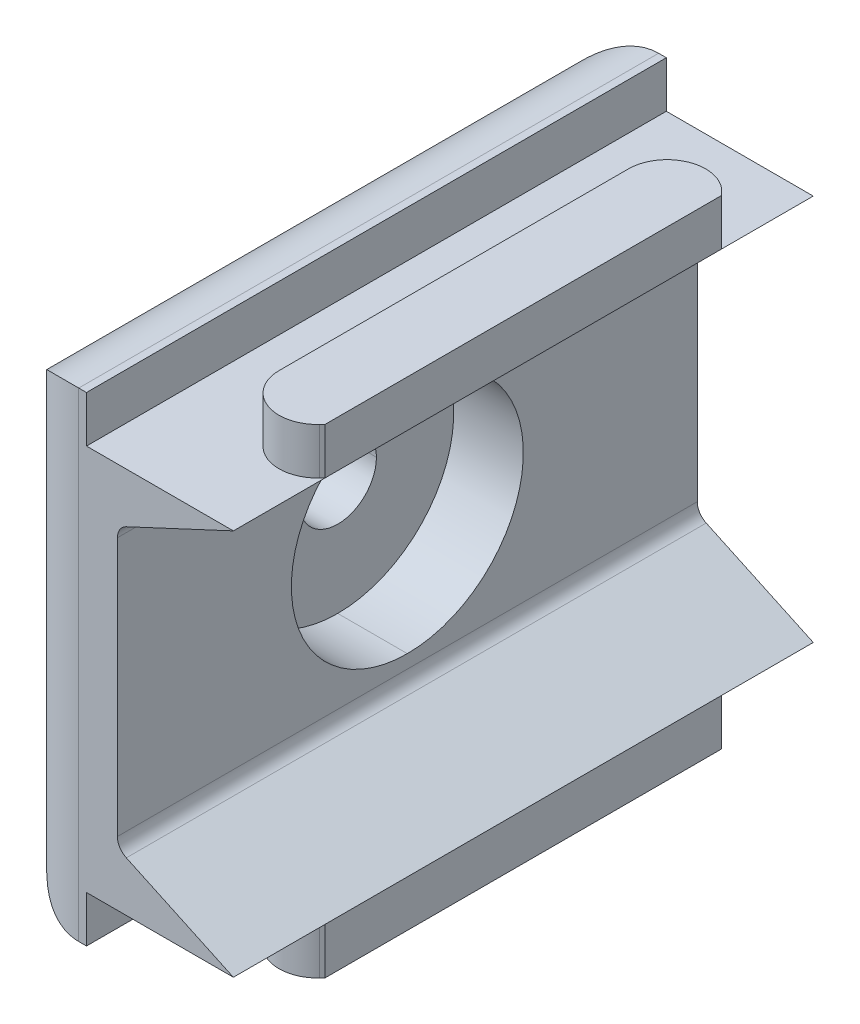
ISO-10303-21;
HEADER;
FILE_DESCRIPTION(('STEP AP214'),'2;1');
FILE_NAME('part.step','',(''),(''),'','','');
FILE_SCHEMA(('AUTOMOTIVE_DESIGN { 1 0 10303 214 1 1 1 1 }'));
ENDSEC;
DATA;
#1=APPLICATION_CONTEXT('core data for automotive mechanical design processes');
#2=APPLICATION_PROTOCOL_DEFINITION('international standard','automotive_design',2000,#1);
#3=PRODUCT_CONTEXT('',#1,'mechanical');
#4=PRODUCT('Part','Part','',(#3));
#5=PRODUCT_RELATED_PRODUCT_CATEGORY('part','',(#4));
#6=PRODUCT_DEFINITION_FORMATION('','',#4);
#7=PRODUCT_DEFINITION_CONTEXT('part definition',#1,'design');
#8=PRODUCT_DEFINITION('design','',#6,#7);
#9=PRODUCT_DEFINITION_SHAPE('','',#8);
#10=(LENGTH_UNIT() NAMED_UNIT(*) SI_UNIT(.MILLI.,.METRE.));
#11=(NAMED_UNIT(*) PLANE_ANGLE_UNIT() SI_UNIT($,.RADIAN.));
#12=(NAMED_UNIT(*) SI_UNIT($,.STERADIAN.) SOLID_ANGLE_UNIT());
#13=UNCERTAINTY_MEASURE_WITH_UNIT(LENGTH_MEASURE(1.E-05),#10,'distance_accuracy_value','');
#14=(GEOMETRIC_REPRESENTATION_CONTEXT(3) GLOBAL_UNCERTAINTY_ASSIGNED_CONTEXT((#13)) GLOBAL_UNIT_ASSIGNED_CONTEXT((#10,
#11,#12)) REPRESENTATION_CONTEXT('',''));
#15=CARTESIAN_POINT('',(0.,0.,0.));
#16=DIRECTION('',(0.,0.,1.));
#17=DIRECTION('',(1.,0.,0.));
#18=AXIS2_PLACEMENT_3D('',#15,#16,#17);
#19=CARTESIAN_POINT('',(17.,41.7312446060602,75.));
#20=DIRECTION('',(0.,0.,1.));
#21=DIRECTION('',(1.,0.,0.));
#22=AXIS2_PLACEMENT_3D('',#19,#20,#21);
#23=CYLINDRICAL_SURFACE('',#22,2.);
#24=CARTESIAN_POINT('',(17.,41.7312446060602,75.));
#25=DIRECTION('',(0.,0.,-1.));
#26=DIRECTION('',(-1.,0.,0.));
#27=AXIS2_PLACEMENT_3D('',#24,#25,#26);
#28=CIRCLE('',#27,2.);
#29=CARTESIAN_POINT('',(15.,41.7312446060602,75.));
#30=VERTEX_POINT('',#29);
#31=CARTESIAN_POINT('',(16.1547634765186,43.5438601801334,75.));
#32=VERTEX_POINT('',#31);
#33=EDGE_CURVE('E304',#30,#32,#28,.T.);
#34=ORIENTED_EDGE('',*,*,#33,.F.);
#35=DIRECTION('',(0.,0.,1.));
#36=VECTOR('',#35,1.);
#37=CARTESIAN_POINT('',(15.,41.7312446060602,75.));
#38=LINE('',#37,#36);
#39=CARTESIAN_POINT('',(15.,41.7312446060602,0.));
#40=VERTEX_POINT('',#39);
#41=EDGE_CURVE('E517',#40,#30,#38,.T.);
#42=ORIENTED_EDGE('',*,*,#41,.F.);
#43=CARTESIAN_POINT('',(17.,41.7312446060602,0.));
#44=DIRECTION('',(0.,0.,1.));
#45=DIRECTION('',(-1.,0.,0.));
#46=AXIS2_PLACEMENT_3D('',#43,#44,#45);
#47=CIRCLE('',#46,2.);
#48=CARTESIAN_POINT('',(16.1547634765186,43.5438601801334,0.));
#49=VERTEX_POINT('',#48);
#50=EDGE_CURVE('E294',#49,#40,#47,.T.);
#51=ORIENTED_EDGE('',*,*,#50,.F.);
#52=DIRECTION('',(0.,0.,-1.));
#53=VECTOR('',#52,1.);
#54=CARTESIAN_POINT('',(16.1547634765186,43.5438601801334,0.));
#55=LINE('',#54,#53);
#56=EDGE_CURVE('E408',#32,#49,#55,.T.);
#57=ORIENTED_EDGE('',*,*,#56,.F.);
#58=EDGE_LOOP('',(#34,#42,#51,#57));
#59=FACE_BOUND('',#58,.T.);
#60=ADVANCED_FACE('F16',(#59),#23,.F.);
#61=CARTESIAN_POINT('',(17.,8.26875539393999,75.));
#62=DIRECTION('',(0.,0.,1.));
#63=DIRECTION('',(1.,0.,0.));
#64=AXIS2_PLACEMENT_3D('',#61,#62,#63);
#65=CYLINDRICAL_SURFACE('',#64,2.);
#66=CARTESIAN_POINT('',(17.,8.26875539393999,75.));
#67=DIRECTION('',(0.,0.,-1.));
#68=DIRECTION('',(-1.,0.,0.));
#69=AXIS2_PLACEMENT_3D('',#66,#67,#68);
#70=CIRCLE('',#69,2.);
#71=CARTESIAN_POINT('',(16.1547634765186,6.45613981986669,75.));
#72=VERTEX_POINT('',#71);
#73=CARTESIAN_POINT('',(15.,8.26875539393999,75.));
#74=VERTEX_POINT('',#73);
#75=EDGE_CURVE('E590',#72,#74,#70,.T.);
#76=ORIENTED_EDGE('',*,*,#75,.F.);
#77=DIRECTION('',(0.,0.,1.));
#78=VECTOR('',#77,1.);
#79=CARTESIAN_POINT('',(16.1547634765186,6.45613981986669,75.));
#80=LINE('',#79,#78);
#81=CARTESIAN_POINT('',(16.1547634765186,6.45613981986669,0.));
#82=VERTEX_POINT('',#81);
#83=EDGE_CURVE('E434',#82,#72,#80,.T.);
#84=ORIENTED_EDGE('',*,*,#83,.F.);
#85=CARTESIAN_POINT('',(17.,8.26875539393999,0.));
#86=DIRECTION('',(0.,0.,1.));
#87=DIRECTION('',(-1.,0.,0.));
#88=AXIS2_PLACEMENT_3D('',#85,#86,#87);
#89=CIRCLE('',#88,2.);
#90=CARTESIAN_POINT('',(15.,8.26875539393999,0.));
#91=VERTEX_POINT('',#90);
#92=EDGE_CURVE('E457',#91,#82,#89,.T.);
#93=ORIENTED_EDGE('',*,*,#92,.F.);
#94=DIRECTION('',(0.,0.,-1.));
#95=VECTOR('',#94,1.);
#96=CARTESIAN_POINT('',(15.,8.26875539393999,0.));
#97=LINE('',#96,#95);
#98=EDGE_CURVE('E449',#74,#91,#97,.T.);
#99=ORIENTED_EDGE('',*,*,#98,.F.);
#100=EDGE_LOOP('',(#76,#84,#93,#99));
#101=FACE_BOUND('',#100,.T.);
#102=ADVANCED_FACE('F648',(#101),#65,.F.);
#103=CARTESIAN_POINT('',(10.,46.,0.));
#104=DIRECTION('',(0.,0.,1.));
#105=DIRECTION('',(1.,0.,0.));
#106=AXIS2_PLACEMENT_3D('',#103,#104,#105);
#107=CYLINDRICAL_SURFACE('',#106,10.);
#108=CARTESIAN_POINT('',(10.,56.,0.));
#109=CARTESIAN_POINT('',(4.14213562373095,56.,0.));
#110=CARTESIAN_POINT('',(0.,51.857864376269,4.14213562373095));
#111=CARTESIAN_POINT('',(0.,46.,10.));
#112=(BOUNDED_CURVE() B_SPLINE_CURVE(3,(#108,#109,#110,#111),.UNSPECIFIED.,.F.,
.F.) B_SPLINE_CURVE_WITH_KNOTS((4,4),(0.,1.5707963267949),
.UNSPECIFIED.) CURVE() GEOMETRIC_REPRESENTATION_ITEM() RATIONAL_B_SPLINE_CURVE((1.,
0.804737854124365,0.804737854124365,1.)) REPRESENTATION_ITEM(''));
#113=CARTESIAN_POINT('',(10.,56.,0.));
#114=VERTEX_POINT('',#113);
#115=CARTESIAN_POINT('',(0.,46.,10.));
#116=VERTEX_POINT('',#115);
#117=EDGE_CURVE('E26',#114,#116,#112,.T.);
#118=ORIENTED_EDGE('',*,*,#117,.T.);
#119=DIRECTION('',(0.,0.,-1.));
#120=VECTOR('',#119,1.);
#121=CARTESIAN_POINT('',(0.,46.,75.));
#122=LINE('',#121,#120);
#123=CARTESIAN_POINT('',(0.,46.,65.));
#124=VERTEX_POINT('',#123);
#125=EDGE_CURVE('E398',#124,#116,#122,.T.);
#126=ORIENTED_EDGE('',*,*,#125,.F.);
#127=CARTESIAN_POINT('',(0.,46.,65.));
#128=CARTESIAN_POINT('',(0.,51.857864376269,70.857864376269));
#129=CARTESIAN_POINT('',(4.14213562373095,56.,75.));
#130=CARTESIAN_POINT('',(10.,56.,75.));
#131=(BOUNDED_CURVE() B_SPLINE_CURVE(3,(#127,#128,#129,#130),.UNSPECIFIED.,.F.,
.F.) B_SPLINE_CURVE_WITH_KNOTS((4,4),(1.5707963267949,3.1415926535898),
.UNSPECIFIED.) CURVE() GEOMETRIC_REPRESENTATION_ITEM() RATIONAL_B_SPLINE_CURVE((1.,
0.804737854124365,0.804737854124365,1.)) REPRESENTATION_ITEM(''));
#132=CARTESIAN_POINT('',(10.,56.,75.));
#133=VERTEX_POINT('',#132);
#134=EDGE_CURVE('E10',#124,#133,#131,.T.);
#135=ORIENTED_EDGE('',*,*,#134,.T.);
#136=DIRECTION('',(0.,0.,1.));
#137=VECTOR('',#136,1.);
#138=CARTESIAN_POINT('',(10.,56.,0.));
#139=LINE('',#138,#137);
#140=EDGE_CURVE('E540',#114,#133,#139,.T.);
#141=ORIENTED_EDGE('',*,*,#140,.F.);
#142=EDGE_LOOP('',(#118,#126,#135,#141));
#143=FACE_BOUND('',#142,.T.);
#144=ADVANCED_FACE('F1134',(#143),#107,.T.);
#145=CARTESIAN_POINT('',(10.,0.,65.));
#146=DIRECTION('',(0.,-1.,0.));
#147=DIRECTION('',(0.,0.,-1.));
#148=AXIS2_PLACEMENT_3D('',#145,#146,#147);
#149=CYLINDRICAL_SURFACE('',#148,10.);
#150=CARTESIAN_POINT('',(0.,4.,65.));
#151=CARTESIAN_POINT('',(0.,-1.85786437626905,70.857864376269));
#152=CARTESIAN_POINT('',(4.14213562373095,-6.,75.));
#153=CARTESIAN_POINT('',(10.,-6.,75.));
#154=(BOUNDED_CURVE() B_SPLINE_CURVE(3,(#150,#151,#152,#153),.UNSPECIFIED.,.F.,
.F.) B_SPLINE_CURVE_WITH_KNOTS((4,4),(1.5707963267949,3.1415926535898),
.UNSPECIFIED.) CURVE() GEOMETRIC_REPRESENTATION_ITEM() RATIONAL_B_SPLINE_CURVE((1.,
0.804737854124365,0.804737854124365,1.)) REPRESENTATION_ITEM(''));
#155=CARTESIAN_POINT('',(0.,4.,65.));
#156=VERTEX_POINT('',#155);
#157=CARTESIAN_POINT('',(10.,-6.,75.));
#158=VERTEX_POINT('',#157);
#159=EDGE_CURVE('E440',#156,#158,#154,.T.);
#160=ORIENTED_EDGE('',*,*,#159,.T.);
#161=DIRECTION('',(0.,-1.,0.));
#162=VECTOR('',#161,1.);
#163=CARTESIAN_POINT('',(10.,0.,75.));
#164=LINE('',#163,#162);
#165=EDGE_CURVE('E424',#133,#158,#164,.T.);
#166=ORIENTED_EDGE('',*,*,#165,.F.);
#167=ORIENTED_EDGE('',*,*,#134,.F.);
#168=DIRECTION('',(0.,1.,0.));
#169=VECTOR('',#168,1.);
#170=CARTESIAN_POINT('',(0.,0.,65.));
#171=LINE('',#170,#169);
#172=EDGE_CURVE('E394',#156,#124,#171,.T.);
#173=ORIENTED_EDGE('',*,*,#172,.F.);
#174=EDGE_LOOP('',(#160,#166,#167,#173));
#175=FACE_BOUND('',#174,.T.);
#176=ADVANCED_FACE('F1158',(#175),#149,.T.);
#177=CARTESIAN_POINT('',(10.,0.,10.));
#178=DIRECTION('',(0.,1.,0.));
#179=DIRECTION('',(0.,0.,1.));
#180=AXIS2_PLACEMENT_3D('',#177,#178,#179);
#181=CYLINDRICAL_SURFACE('',#180,10.);
#182=CARTESIAN_POINT('',(10.,-6.,0.));
#183=CARTESIAN_POINT('',(4.14213562373095,-6.,0.));
#184=CARTESIAN_POINT('',(0.,-1.85786437626905,4.14213562373095));
#185=CARTESIAN_POINT('',(0.,4.,10.));
#186=(BOUNDED_CURVE() B_SPLINE_CURVE(3,(#182,#183,#184,#185),.UNSPECIFIED.,.F.,
.F.) B_SPLINE_CURVE_WITH_KNOTS((4,4),(0.,1.5707963267949),
.UNSPECIFIED.) CURVE() GEOMETRIC_REPRESENTATION_ITEM() RATIONAL_B_SPLINE_CURVE((1.,
0.804737854124365,0.804737854124365,1.)) REPRESENTATION_ITEM(''));
#187=CARTESIAN_POINT('',(10.,-6.,0.));
#188=VERTEX_POINT('',#187);
#189=CARTESIAN_POINT('',(0.,4.,10.));
#190=VERTEX_POINT('',#189);
#191=EDGE_CURVE('E472',#188,#190,#186,.T.);
#192=ORIENTED_EDGE('',*,*,#191,.T.);
#193=DIRECTION('',(0.,-1.,0.));
#194=VECTOR('',#193,1.);
#195=CARTESIAN_POINT('',(0.,-6.,10.));
#196=LINE('',#195,#194);
#197=EDGE_CURVE('E376',#116,#190,#196,.T.);
#198=ORIENTED_EDGE('',*,*,#197,.F.);
#199=ORIENTED_EDGE('',*,*,#117,.F.);
#200=DIRECTION('',(0.,1.,0.));
#201=VECTOR('',#200,1.);
#202=CARTESIAN_POINT('',(10.,56.,0.));
#203=LINE('',#202,#201);
#204=EDGE_CURVE('E494',#188,#114,#203,.T.);
#205=ORIENTED_EDGE('',*,*,#204,.F.);
#206=EDGE_LOOP('',(#192,#198,#199,#205));
#207=FACE_BOUND('',#206,.T.);
#208=ADVANCED_FACE('F1150',(#207),#181,.T.);
#209=CARTESIAN_POINT('',(10.,4.,0.));
#210=DIRECTION('',(0.,0.,-1.));
#211=DIRECTION('',(-1.,0.,0.));
#212=AXIS2_PLACEMENT_3D('',#209,#210,#211);
#213=CYLINDRICAL_SURFACE('',#212,10.);
#214=ORIENTED_EDGE('',*,*,#159,.F.);
#215=DIRECTION('',(0.,0.,1.));
#216=VECTOR('',#215,1.);
#217=CARTESIAN_POINT('',(0.,4.,75.));
#218=LINE('',#217,#216);
#219=EDGE_CURVE('E526',#190,#156,#218,.T.);
#220=ORIENTED_EDGE('',*,*,#219,.F.);
#221=ORIENTED_EDGE('',*,*,#191,.F.);
#222=DIRECTION('',(0.,0.,-1.));
#223=VECTOR('',#222,1.);
#224=CARTESIAN_POINT('',(10.,-6.,0.));
#225=LINE('',#224,#223);
#226=EDGE_CURVE('E436',#158,#188,#225,.T.);
#227=ORIENTED_EDGE('',*,*,#226,.F.);
#228=EDGE_LOOP('',(#214,#220,#221,#227));
#229=FACE_BOUND('',#228,.T.);
#230=ADVANCED_FACE('F1546',(#229),#213,.T.);
#231=CARTESIAN_POINT('',(0.,-6.,0.));
#232=DIRECTION('',(0.,1.,0.));
#233=DIRECTION('',(1.,0.,0.));
#234=AXIS2_PLACEMENT_3D('',#231,#232,#233);
#235=PLANE('',#234);
#236=DIRECTION('',(-1.,0.,0.));
#237=VECTOR('',#236,1.);
#238=CARTESIAN_POINT('',(0.,-6.,75.));
#239=LINE('',#238,#237);
#240=CARTESIAN_POINT('',(11.,-6.,75.));
#241=VERTEX_POINT('',#240);
#242=EDGE_CURVE('E419',#241,#158,#239,.T.);
#243=ORIENTED_EDGE('',*,*,#242,.T.);
#244=ORIENTED_EDGE('',*,*,#226,.T.);
#245=DIRECTION('',(1.,0.,0.));
#246=VECTOR('',#245,1.);
#247=CARTESIAN_POINT('',(0.,-6.,0.));
#248=LINE('',#247,#246);
#249=CARTESIAN_POINT('',(11.,-6.,0.));
#250=VERTEX_POINT('',#249);
#251=EDGE_CURVE('E485',#188,#250,#248,.T.);
#252=ORIENTED_EDGE('',*,*,#251,.T.);
#253=DIRECTION('',(0.,0.,1.));
#254=VECTOR('',#253,1.);
#255=CARTESIAN_POINT('',(11.,-6.,0.));
#256=LINE('',#255,#254);
#257=EDGE_CURVE('E441',#250,#241,#256,.T.);
#258=ORIENTED_EDGE('',*,*,#257,.T.);
#259=EDGE_LOOP('',(#243,#244,#252,#258));
#260=FACE_BOUND('',#259,.T.);
#261=ADVANCED_FACE('F1147',(#260),#235,.F.);
#262=CARTESIAN_POINT('',(11.,-6.,0.));
#263=DIRECTION('',(-1.,0.,0.));
#264=DIRECTION('',(0.,1.,0.));
#265=AXIS2_PLACEMENT_3D('',#262,#263,#264);
#266=PLANE('',#265);
#267=DIRECTION('',(0.,0.,1.));
#268=VECTOR('',#267,1.);
#269=CARTESIAN_POINT('',(11.,0.,0.));
#270=LINE('',#269,#268);
#271=CARTESIAN_POINT('',(11.,0.,0.));
#272=VERTEX_POINT('',#271);
#273=CARTESIAN_POINT('',(11.,0.,75.));
#274=VERTEX_POINT('',#273);
#275=EDGE_CURVE('E538',#272,#274,#270,.T.);
#276=ORIENTED_EDGE('',*,*,#275,.T.);
#277=DIRECTION('',(0.,1.,0.));
#278=VECTOR('',#277,1.);
#279=CARTESIAN_POINT('',(11.,-6.,75.));
#280=LINE('',#279,#278);
#281=EDGE_CURVE('E423',#241,#274,#280,.T.);
#282=ORIENTED_EDGE('',*,*,#281,.F.);
#283=ORIENTED_EDGE('',*,*,#257,.F.);
#284=DIRECTION('',(0.,1.,0.));
#285=VECTOR('',#284,1.);
#286=CARTESIAN_POINT('',(11.,-6.,0.));
#287=LINE('',#286,#285);
#288=EDGE_CURVE('E507',#250,#272,#287,.T.);
#289=ORIENTED_EDGE('',*,*,#288,.T.);
#290=EDGE_LOOP('',(#276,#282,#283,#289));
#291=FACE_BOUND('',#290,.T.);
#292=ADVANCED_FACE('F1144',(#291),#266,.F.);
#293=CARTESIAN_POINT('',(0.,56.,0.));
#294=DIRECTION('',(0.,-1.,0.));
#295=DIRECTION('',(0.,0.,-1.));
#296=AXIS2_PLACEMENT_3D('',#293,#294,#295);
#297=PLANE('',#296);
#298=DIRECTION('',(-1.,0.,0.));
#299=VECTOR('',#298,1.);
#300=CARTESIAN_POINT('',(0.,56.,0.));
#301=LINE('',#300,#299);
#302=CARTESIAN_POINT('',(11.,56.,0.));
#303=VERTEX_POINT('',#302);
#304=EDGE_CURVE('E576',#303,#114,#301,.T.);
#305=ORIENTED_EDGE('',*,*,#304,.T.);
#306=ORIENTED_EDGE('',*,*,#140,.T.);
#307=DIRECTION('',(1.,0.,0.));
#308=VECTOR('',#307,1.);
#309=CARTESIAN_POINT('',(0.,56.,75.));
#310=LINE('',#309,#308);
#311=CARTESIAN_POINT('',(11.,56.,75.));
#312=VERTEX_POINT('',#311);
#313=EDGE_CURVE('E530',#133,#312,#310,.T.);
#314=ORIENTED_EDGE('',*,*,#313,.T.);
#315=DIRECTION('',(0.,0.,-1.));
#316=VECTOR('',#315,1.);
#317=CARTESIAN_POINT('',(11.,56.,75.));
#318=LINE('',#317,#316);
#319=EDGE_CURVE('E195',#312,#303,#318,.T.);
#320=ORIENTED_EDGE('',*,*,#319,.T.);
#321=EDGE_LOOP('',(#305,#306,#314,#320));
#322=FACE_BOUND('',#321,.T.);
#323=ADVANCED_FACE('F1154',(#322),#297,.F.);
#324=CARTESIAN_POINT('',(11.,56.,75.));
#325=DIRECTION('',(-1.,0.,0.));
#326=DIRECTION('',(0.,0.,1.));
#327=AXIS2_PLACEMENT_3D('',#324,#325,#326);
#328=PLANE('',#327);
#329=DIRECTION('',(0.,0.,-1.));
#330=VECTOR('',#329,1.);
#331=CARTESIAN_POINT('',(11.,50.,75.));
#332=LINE('',#331,#330);
#333=CARTESIAN_POINT('',(11.,50.,75.));
#334=VERTEX_POINT('',#333);
#335=CARTESIAN_POINT('',(11.,50.,0.));
#336=VERTEX_POINT('',#335);
#337=EDGE_CURVE('E480',#334,#336,#332,.T.);
#338=ORIENTED_EDGE('',*,*,#337,.T.);
#339=DIRECTION('',(0.,-1.,0.));
#340=VECTOR('',#339,1.);
#341=CARTESIAN_POINT('',(11.,56.,0.));
#342=LINE('',#341,#340);
#343=EDGE_CURVE('E458',#303,#336,#342,.T.);
#344=ORIENTED_EDGE('',*,*,#343,.F.);
#345=ORIENTED_EDGE('',*,*,#319,.F.);
#346=DIRECTION('',(0.,-1.,0.));
#347=VECTOR('',#346,1.);
#348=CARTESIAN_POINT('',(11.,56.,75.));
#349=LINE('',#348,#347);
#350=EDGE_CURVE('E482',#312,#334,#349,.T.);
#351=ORIENTED_EDGE('',*,*,#350,.T.);
#352=EDGE_LOOP('',(#338,#344,#345,#351));
#353=FACE_BOUND('',#352,.T.);
#354=ADVANCED_FACE('F1165',(#353),#328,.F.);
#355=CARTESIAN_POINT('',(0.,-6.,0.));
#356=DIRECTION('',(0.,-1.,0.));
#357=DIRECTION('',(0.,0.,-1.));
#358=AXIS2_PLACEMENT_3D('',#355,#356,#357);
#359=PLANE('',#358);
#360=DIRECTION('',(0.,0.,1.));
#361=VECTOR('',#360,1.);
#362=CARTESIAN_POINT('',(21.,-6.,0.));
#363=LINE('',#362,#361);
#364=CARTESIAN_POINT('',(21.,-6.,14.904265208426));
#365=VERTEX_POINT('',#364);
#366=CARTESIAN_POINT('',(21.,-6.,60.0957347915741));
#367=VERTEX_POINT('',#366);
#368=EDGE_CURVE('E561',#365,#367,#363,.T.);
#369=ORIENTED_EDGE('',*,*,#368,.F.);
#370=CARTESIAN_POINT('',(26.,-6.,14.904265208426));
#371=DIRECTION('',(0.,-1.,0.));
#372=DIRECTION('',(1.,0.,0.));
#373=AXIS2_PLACEMENT_3D('',#370,#371,#372);
#374=CIRCLE('',#373,5.);
#375=CARTESIAN_POINT('',(29.6412568589885,-6.,11.4777146853971));
#376=VERTEX_POINT('',#375);
#377=EDGE_CURVE('E350',#365,#376,#374,.T.);
#378=ORIENTED_EDGE('',*,*,#377,.T.);
#379=DIRECTION('',(-0.68531010460578,0.,-0.728251371797689));
#380=VECTOR('',#379,1.);
#381=CARTESIAN_POINT('',(9.9919672064407,-6.,-9.40279188841087));
#382=LINE('',#381,#380);
#383=CARTESIAN_POINT('',(30.,-6.,11.8589365334464));
#384=VERTEX_POINT('',#383);
#385=EDGE_CURVE('E346',#384,#376,#382,.T.);
#386=ORIENTED_EDGE('',*,*,#385,.F.);
#387=DIRECTION('',(0.,0.,1.));
#388=VECTOR('',#387,1.);
#389=CARTESIAN_POINT('',(30.,-6.,0.));
#390=LINE('',#389,#388);
#391=CARTESIAN_POINT('',(30.,-6.,63.1410634665537));
#392=VERTEX_POINT('',#391);
#393=EDGE_CURVE('E454',#384,#392,#390,.T.);
#394=ORIENTED_EDGE('',*,*,#393,.T.);
#395=DIRECTION('',(0.685310104605782,0.,-0.728251371797687));
#396=VECTOR('',#395,1.);
#397=CARTESIAN_POINT('',(47.4228189903889,-6.,44.62653734902));
#398=LINE('',#397,#396);
#399=CARTESIAN_POINT('',(29.6412568589885,-6.,63.522285314603));
#400=VERTEX_POINT('',#399);
#401=EDGE_CURVE('E453',#400,#392,#398,.T.);
#402=ORIENTED_EDGE('',*,*,#401,.F.);
#403=CARTESIAN_POINT('',(26.,-6.,60.0957347915741));
#404=DIRECTION('',(0.,-1.,0.));
#405=DIRECTION('',(1.,0.,0.));
#406=AXIS2_PLACEMENT_3D('',#403,#404,#405);
#407=CIRCLE('',#406,5.);
#408=EDGE_CURVE('E41',#400,#367,#407,.T.);
#409=ORIENTED_EDGE('',*,*,#408,.T.);
#410=EDGE_LOOP('',(#369,#378,#386,#394,#402,#409));
#411=FACE_BOUND('',#410,.T.);
#412=ADVANCED_FACE('F709',(#411),#359,.T.);
#413=CARTESIAN_POINT('',(26.,-6.,60.0957347915741));
#414=DIRECTION('',(0.,1.,0.));
#415=DIRECTION('',(-1.,0.,0.));
#416=AXIS2_PLACEMENT_3D('',#413,#414,#415);
#417=CYLINDRICAL_SURFACE('',#416,5.);
#418=CARTESIAN_POINT('',(26.,0.,60.0957347915741));
#419=DIRECTION('',(0.,-1.,0.));
#420=DIRECTION('',(1.,0.,0.));
#421=AXIS2_PLACEMENT_3D('',#418,#419,#420);
#422=CIRCLE('',#421,5.);
#423=CARTESIAN_POINT('',(29.6412568589885,0.,63.522285314603));
#424=VERTEX_POINT('',#423);
#425=CARTESIAN_POINT('',(21.,0.,60.0957347915741));
#426=VERTEX_POINT('',#425);
#427=EDGE_CURVE('E490',#424,#426,#422,.T.);
#428=ORIENTED_EDGE('',*,*,#427,.T.);
#429=DIRECTION('',(0.,1.,0.));
#430=VECTOR('',#429,1.);
#431=CARTESIAN_POINT('',(21.,-6.,60.0957347915741));
#432=LINE('',#431,#430);
#433=EDGE_CURVE('E93',#367,#426,#432,.T.);
#434=ORIENTED_EDGE('',*,*,#433,.F.);
#435=ORIENTED_EDGE('',*,*,#408,.F.);
#436=DIRECTION('',(0.,1.,0.));
#437=VECTOR('',#436,1.);
#438=CARTESIAN_POINT('',(29.6412568589885,-6.,63.522285314603));
#439=LINE('',#438,#437);
#440=EDGE_CURVE('E80',#400,#424,#439,.T.);
#441=ORIENTED_EDGE('',*,*,#440,.T.);
#442=EDGE_LOOP('',(#428,#434,#435,#441));
#443=FACE_BOUND('',#442,.T.);
#444=ADVANCED_FACE('F1114',(#443),#417,.T.);
#445=CARTESIAN_POINT('',(47.4228189903889,-6.,44.62653734902));
#446=DIRECTION('',(0.728251371797686,0.,0.685310104605782));
#447=DIRECTION('',(0.,-1.,0.));
#448=AXIS2_PLACEMENT_3D('',#445,#446,#447);
#449=PLANE('',#448);
#450=DIRECTION('',(0.685310104605782,0.,-0.728251371797687));
#451=VECTOR('',#450,1.);
#452=CARTESIAN_POINT('',(47.4228189903889,0.,44.62653734902));
#453=LINE('',#452,#451);
#454=CARTESIAN_POINT('',(30.,0.,63.1410634665537));
#455=VERTEX_POINT('',#454);
#456=EDGE_CURVE('E486',#424,#455,#453,.T.);
#457=ORIENTED_EDGE('',*,*,#456,.F.);
#458=ORIENTED_EDGE('',*,*,#440,.F.);
#459=ORIENTED_EDGE('',*,*,#401,.T.);
#460=DIRECTION('',(0.,1.,0.));
#461=VECTOR('',#460,1.);
#462=CARTESIAN_POINT('',(30.,-6.,63.1410634665537));
#463=LINE('',#462,#461);
#464=EDGE_CURVE('E411',#392,#455,#463,.T.);
#465=ORIENTED_EDGE('',*,*,#464,.T.);
#466=EDGE_LOOP('',(#457,#458,#459,#465));
#467=FACE_BOUND('',#466,.T.);
#468=ADVANCED_FACE('F700',(#467),#449,.T.);
#469=CARTESIAN_POINT('',(30.,-6.,0.));
#470=DIRECTION('',(-1.,0.,0.));
#471=DIRECTION('',(0.,1.,0.));
#472=AXIS2_PLACEMENT_3D('',#469,#470,#471);
#473=PLANE('',#472);
#474=DIRECTION('',(0.,0.,1.));
#475=VECTOR('',#474,1.);
#476=CARTESIAN_POINT('',(30.,0.,0.));
#477=LINE('',#476,#475);
#478=CARTESIAN_POINT('',(30.,0.,11.8589365334464));
#479=VERTEX_POINT('',#478);
#480=EDGE_CURVE('E450',#479,#455,#477,.T.);
#481=ORIENTED_EDGE('',*,*,#480,.T.);
#482=ORIENTED_EDGE('',*,*,#464,.F.);
#483=ORIENTED_EDGE('',*,*,#393,.F.);
#484=DIRECTION('',(0.,1.,0.));
#485=VECTOR('',#484,1.);
#486=CARTESIAN_POINT('',(30.,-6.,11.8589365334464));
#487=LINE('',#486,#485);
#488=EDGE_CURVE('E412',#384,#479,#487,.T.);
#489=ORIENTED_EDGE('',*,*,#488,.T.);
#490=EDGE_LOOP('',(#481,#482,#483,#489));
#491=FACE_BOUND('',#490,.T.);
#492=ADVANCED_FACE('F704',(#491),#473,.F.);
#493=CARTESIAN_POINT('',(9.9919672064407,-6.,-9.40279188841087));
#494=DIRECTION('',(0.728251371797689,0.,-0.68531010460578));
#495=DIRECTION('',(0.,-1.,0.));
#496=AXIS2_PLACEMENT_3D('',#493,#494,#495);
#497=PLANE('',#496);
#498=DIRECTION('',(-0.68531010460578,0.,-0.728251371797689));
#499=VECTOR('',#498,1.);
#500=CARTESIAN_POINT('',(9.9919672064407,0.,-9.40279188841087));
#501=LINE('',#500,#499);
#502=CARTESIAN_POINT('',(29.6412568589885,0.,11.4777146853971));
#503=VERTEX_POINT('',#502);
#504=EDGE_CURVE('E343',#479,#503,#501,.T.);
#505=ORIENTED_EDGE('',*,*,#504,.F.);
#506=ORIENTED_EDGE('',*,*,#488,.F.);
#507=ORIENTED_EDGE('',*,*,#385,.T.);
#508=DIRECTION('',(0.,1.,0.));
#509=VECTOR('',#508,1.);
#510=CARTESIAN_POINT('',(29.6412568589885,-6.,11.4777146853971));
#511=LINE('',#510,#509);
#512=EDGE_CURVE('E338',#376,#503,#511,.T.);
#513=ORIENTED_EDGE('',*,*,#512,.T.);
#514=EDGE_LOOP('',(#505,#506,#507,#513));
#515=FACE_BOUND('',#514,.T.);
#516=ADVANCED_FACE('F340',(#515),#497,.T.);
#517=CARTESIAN_POINT('',(26.,-6.,14.904265208426));
#518=DIRECTION('',(0.,1.,0.));
#519=DIRECTION('',(-1.,0.,0.));
#520=AXIS2_PLACEMENT_3D('',#517,#518,#519);
#521=CYLINDRICAL_SURFACE('',#520,5.);
#522=CARTESIAN_POINT('',(26.,0.,14.904265208426));
#523=DIRECTION('',(0.,-1.,0.));
#524=DIRECTION('',(1.,0.,0.));
#525=AXIS2_PLACEMENT_3D('',#522,#523,#524);
#526=CIRCLE('',#525,5.);
#527=CARTESIAN_POINT('',(21.,0.,14.904265208426));
#528=VERTEX_POINT('',#527);
#529=EDGE_CURVE('E353',#528,#503,#526,.T.);
#530=ORIENTED_EDGE('',*,*,#529,.T.);
#531=ORIENTED_EDGE('',*,*,#512,.F.);
#532=ORIENTED_EDGE('',*,*,#377,.F.);
#533=DIRECTION('',(0.,1.,0.));
#534=VECTOR('',#533,1.);
#535=CARTESIAN_POINT('',(21.,-6.,14.904265208426));
#536=LINE('',#535,#534);
#537=EDGE_CURVE('E356',#365,#528,#536,.T.);
#538=ORIENTED_EDGE('',*,*,#537,.T.);
#539=EDGE_LOOP('',(#530,#531,#532,#538));
#540=FACE_BOUND('',#539,.T.);
#541=ADVANCED_FACE('F354',(#540),#521,.T.);
#542=CARTESIAN_POINT('',(21.,-6.,0.));
#543=DIRECTION('',(-1.,0.,0.));
#544=DIRECTION('',(0.,1.,0.));
#545=AXIS2_PLACEMENT_3D('',#542,#543,#544);
#546=PLANE('',#545);
#547=DIRECTION('',(0.,0.,1.));
#548=VECTOR('',#547,1.);
#549=CARTESIAN_POINT('',(21.,0.,0.));
#550=LINE('',#549,#548);
#551=EDGE_CURVE('E360',#528,#426,#550,.T.);
#552=ORIENTED_EDGE('',*,*,#551,.F.);
#553=ORIENTED_EDGE('',*,*,#537,.F.);
#554=ORIENTED_EDGE('',*,*,#368,.T.);
#555=ORIENTED_EDGE('',*,*,#433,.T.);
#556=EDGE_LOOP('',(#552,#553,#554,#555));
#557=FACE_BOUND('',#556,.T.);
#558=ADVANCED_FACE('F1115',(#557),#546,.T.);
#559=CARTESIAN_POINT('',(26.,56.,60.0957347915741));
#560=DIRECTION('',(0.,-1.,0.));
#561=DIRECTION('',(0.,0.,-1.));
#562=AXIS2_PLACEMENT_3D('',#559,#560,#561);
#563=CYLINDRICAL_SURFACE('',#562,5.);
#564=CARTESIAN_POINT('',(26.,56.,60.0957347915741));
#565=DIRECTION('',(0.,1.,0.));
#566=DIRECTION('',(0.,0.,-1.));
#567=AXIS2_PLACEMENT_3D('',#564,#565,#566);
#568=CIRCLE('',#567,5.);
#569=CARTESIAN_POINT('',(21.,56.,60.0957347915741));
#570=VERTEX_POINT('',#569);
#571=CARTESIAN_POINT('',(29.6412568589885,56.,63.522285314603));
#572=VERTEX_POINT('',#571);
#573=EDGE_CURVE('E384',#570,#572,#568,.T.);
#574=ORIENTED_EDGE('',*,*,#573,.F.);
#575=DIRECTION('',(0.,1.,0.));
#576=VECTOR('',#575,1.);
#577=CARTESIAN_POINT('',(21.,56.,60.0957347915741));
#578=LINE('',#577,#576);
#579=CARTESIAN_POINT('',(21.,50.,60.0957347915741));
#580=VERTEX_POINT('',#579);
#581=EDGE_CURVE('E591',#580,#570,#578,.T.);
#582=ORIENTED_EDGE('',*,*,#581,.F.);
#583=CARTESIAN_POINT('',(26.,50.,60.0957347915741));
#584=DIRECTION('',(0.,-1.,0.));
#585=DIRECTION('',(0.,0.,-1.));
#586=AXIS2_PLACEMENT_3D('',#583,#584,#585);
#587=CIRCLE('',#586,5.);
#588=CARTESIAN_POINT('',(29.6412568589885,50.,63.522285314603));
#589=VERTEX_POINT('',#588);
#590=EDGE_CURVE('E393',#589,#580,#587,.T.);
#591=ORIENTED_EDGE('',*,*,#590,.F.);
#592=DIRECTION('',(0.,-1.,0.));
#593=VECTOR('',#592,1.);
#594=CARTESIAN_POINT('',(29.6412568589885,56.,63.522285314603));
#595=LINE('',#594,#593);
#596=EDGE_CURVE('E534',#572,#589,#595,.T.);
#597=ORIENTED_EDGE('',*,*,#596,.F.);
#598=EDGE_LOOP('',(#574,#582,#591,#597));
#599=FACE_BOUND('',#598,.T.);
#600=ADVANCED_FACE('F1117',(#599),#563,.T.);
#601=CARTESIAN_POINT('',(26.,56.,14.904265208426));
#602=DIRECTION('',(0.,-1.,0.));
#603=DIRECTION('',(0.,0.,-1.));
#604=AXIS2_PLACEMENT_3D('',#601,#602,#603);
#605=CYLINDRICAL_SURFACE('',#604,5.);
#606=DIRECTION('',(0.,-1.,0.));
#607=VECTOR('',#606,1.);
#608=CARTESIAN_POINT('',(26.,56.,9.90426520842599));
#609=LINE('',#608,#607);
#610=CARTESIAN_POINT('',(26.,56.,9.90426520842599));
#611=VERTEX_POINT('',#610);
#612=CARTESIAN_POINT('',(26.,50.,9.90426520842599));
#613=VERTEX_POINT('',#612);
#614=EDGE_CURVE('E383',#611,#613,#609,.T.);
#615=ORIENTED_EDGE('',*,*,#614,.F.);
#616=CARTESIAN_POINT('',(26.,56.,14.904265208426));
#617=DIRECTION('',(0.,1.,0.));
#618=DIRECTION('',(0.,0.,-1.));
#619=AXIS2_PLACEMENT_3D('',#616,#617,#618);
#620=CIRCLE('',#619,5.);
#621=CARTESIAN_POINT('',(29.6412568589885,56.,11.4777146853971));
#622=VERTEX_POINT('',#621);
#623=EDGE_CURVE('E387',#622,#611,#620,.T.);
#624=ORIENTED_EDGE('',*,*,#623,.F.);
#625=DIRECTION('',(0.,1.,0.));
#626=VECTOR('',#625,1.);
#627=CARTESIAN_POINT('',(29.6412568589885,56.,11.4777146853971));
#628=LINE('',#627,#626);
#629=CARTESIAN_POINT('',(29.6412568589885,50.,11.4777146853971));
#630=VERTEX_POINT('',#629);
#631=EDGE_CURVE('E19',#630,#622,#628,.T.);
#632=ORIENTED_EDGE('',*,*,#631,.F.);
#633=CARTESIAN_POINT('',(26.,50.,14.904265208426));
#634=DIRECTION('',(0.,-1.,0.));
#635=DIRECTION('',(0.,0.,-1.));
#636=AXIS2_PLACEMENT_3D('',#633,#634,#635);
#637=CIRCLE('',#636,5.);
#638=EDGE_CURVE('E392',#613,#630,#637,.T.);
#639=ORIENTED_EDGE('',*,*,#638,.F.);
#640=EDGE_LOOP('',(#615,#624,#632,#639));
#641=FACE_BOUND('',#640,.T.);
#642=ADVANCED_FACE('F1124',(#641),#605,.T.);
#643=CARTESIAN_POINT('',(0.,56.,0.));
#644=DIRECTION('',(0.,-1.,0.));
#645=DIRECTION('',(0.,0.,-1.));
#646=AXIS2_PLACEMENT_3D('',#643,#644,#645);
#647=PLANE('',#646);
#648=DIRECTION('',(-0.68531010460578,0.,-0.728251371797688));
#649=VECTOR('',#648,1.);
#650=CARTESIAN_POINT('',(21.,56.,2.295));
#651=LINE('',#650,#649);
#652=CARTESIAN_POINT('',(30.,56.,11.8589365334464));
#653=VERTEX_POINT('',#652);
#654=EDGE_CURVE('E495',#653,#622,#651,.T.);
#655=ORIENTED_EDGE('',*,*,#654,.T.);
#656=ORIENTED_EDGE('',*,*,#623,.T.);
#657=CARTESIAN_POINT('',(26.,56.,14.904265208426));
#658=DIRECTION('',(0.,1.,0.));
#659=DIRECTION('',(0.,0.,-1.));
#660=AXIS2_PLACEMENT_3D('',#657,#658,#659);
#661=CIRCLE('',#660,5.);
#662=CARTESIAN_POINT('',(21.,56.,14.904265208426));
#663=VERTEX_POINT('',#662);
#664=EDGE_CURVE('E564',#611,#663,#661,.T.);
#665=ORIENTED_EDGE('',*,*,#664,.T.);
#666=DIRECTION('',(0.,0.,1.));
#667=VECTOR('',#666,1.);
#668=CARTESIAN_POINT('',(21.,56.,37.5));
#669=LINE('',#668,#667);
#670=EDGE_CURVE('E499',#663,#570,#669,.T.);
#671=ORIENTED_EDGE('',*,*,#670,.T.);
#672=ORIENTED_EDGE('',*,*,#573,.T.);
#673=DIRECTION('',(0.685310104605784,0.,-0.728251371797684));
#674=VECTOR('',#673,1.);
#675=CARTESIAN_POINT('',(30.,56.,63.1410634665537));
#676=LINE('',#675,#674);
#677=CARTESIAN_POINT('',(30.,56.,63.1410634665537));
#678=VERTEX_POINT('',#677);
#679=EDGE_CURVE('E506',#572,#678,#676,.T.);
#680=ORIENTED_EDGE('',*,*,#679,.T.);
#681=DIRECTION('',(0.,0.,-1.));
#682=VECTOR('',#681,1.);
#683=CARTESIAN_POINT('',(30.,56.,63.1410634665537));
#684=LINE('',#683,#682);
#685=EDGE_CURVE('E400',#678,#653,#684,.T.);
#686=ORIENTED_EDGE('',*,*,#685,.T.);
#687=EDGE_LOOP('',(#655,#656,#665,#671,#672,#680,#686));
#688=FACE_BOUND('',#687,.T.);
#689=ADVANCED_FACE('F1197',(#688),#647,.F.);
#690=CARTESIAN_POINT('',(21.,56.,37.5));
#691=DIRECTION('',(1.,0.,0.));
#692=DIRECTION('',(0.,0.,-1.));
#693=AXIS2_PLACEMENT_3D('',#690,#691,#692);
#694=PLANE('',#693);
#695=ORIENTED_EDGE('',*,*,#670,.F.);
#696=DIRECTION('',(0.,-1.,0.));
#697=VECTOR('',#696,1.);
#698=CARTESIAN_POINT('',(21.,56.,14.904265208426));
#699=LINE('',#698,#697);
#700=CARTESIAN_POINT('',(21.,50.,14.904265208426));
#701=VERTEX_POINT('',#700);
#702=EDGE_CURVE('E382',#663,#701,#699,.T.);
#703=ORIENTED_EDGE('',*,*,#702,.T.);
#704=DIRECTION('',(0.,0.,1.));
#705=VECTOR('',#704,1.);
#706=CARTESIAN_POINT('',(21.,50.,37.5));
#707=LINE('',#706,#705);
#708=EDGE_CURVE('E388',#701,#580,#707,.T.);
#709=ORIENTED_EDGE('',*,*,#708,.T.);
#710=ORIENTED_EDGE('',*,*,#581,.T.);
#711=EDGE_LOOP('',(#695,#703,#709,#710));
#712=FACE_BOUND('',#711,.T.);
#713=ADVANCED_FACE('F1182',(#712),#694,.F.);
#714=CARTESIAN_POINT('',(21.,56.,2.295));
#715=DIRECTION('',(-0.728251371797688,0.,0.68531010460578));
#716=DIRECTION('',(0.,1.,0.));
#717=AXIS2_PLACEMENT_3D('',#714,#715,#716);
#718=PLANE('',#717);
#719=DIRECTION('',(-0.68531010460578,0.,-0.728251371797688));
#720=VECTOR('',#719,1.);
#721=CARTESIAN_POINT('',(21.,50.,2.295));
#722=LINE('',#721,#720);
#723=CARTESIAN_POINT('',(30.,50.,11.8589365334464));
#724=VERTEX_POINT('',#723);
#725=EDGE_CURVE('E418',#724,#630,#722,.T.);
#726=ORIENTED_EDGE('',*,*,#725,.T.);
#727=ORIENTED_EDGE('',*,*,#631,.T.);
#728=ORIENTED_EDGE('',*,*,#654,.F.);
#729=DIRECTION('',(0.,-1.,0.));
#730=VECTOR('',#729,1.);
#731=CARTESIAN_POINT('',(30.,56.,11.8589365334464));
#732=LINE('',#731,#730);
#733=EDGE_CURVE('E404',#653,#724,#732,.T.);
#734=ORIENTED_EDGE('',*,*,#733,.T.);
#735=EDGE_LOOP('',(#726,#727,#728,#734));
#736=FACE_BOUND('',#735,.T.);
#737=ADVANCED_FACE('F1192',(#736),#718,.F.);
#738=CARTESIAN_POINT('',(30.,56.,63.1410634665537));
#739=DIRECTION('',(-1.,0.,0.));
#740=DIRECTION('',(0.,1.,0.));
#741=AXIS2_PLACEMENT_3D('',#738,#739,#740);
#742=PLANE('',#741);
#743=DIRECTION('',(0.,0.,-1.));
#744=VECTOR('',#743,1.);
#745=CARTESIAN_POINT('',(30.,50.,63.1410634665537));
#746=LINE('',#745,#744);
#747=CARTESIAN_POINT('',(30.,50.,63.1410634665537));
#748=VERTEX_POINT('',#747);
#749=EDGE_CURVE('E399',#748,#724,#746,.T.);
#750=ORIENTED_EDGE('',*,*,#749,.T.);
#751=ORIENTED_EDGE('',*,*,#733,.F.);
#752=ORIENTED_EDGE('',*,*,#685,.F.);
#753=DIRECTION('',(0.,-1.,0.));
#754=VECTOR('',#753,1.);
#755=CARTESIAN_POINT('',(30.,56.,63.1410634665537));
#756=LINE('',#755,#754);
#757=EDGE_CURVE('E531',#678,#748,#756,.T.);
#758=ORIENTED_EDGE('',*,*,#757,.T.);
#759=EDGE_LOOP('',(#750,#751,#752,#758));
#760=FACE_BOUND('',#759,.T.);
#761=ADVANCED_FACE('F1195',(#760),#742,.F.);
#762=CARTESIAN_POINT('',(30.,56.,63.1410634665537));
#763=DIRECTION('',(-0.728251371797684,0.,-0.685310104605784));
#764=DIRECTION('',(-0.685310104605784,0.,0.728251371797684));
#765=AXIS2_PLACEMENT_3D('',#762,#763,#764);
#766=PLANE('',#765);
#767=ORIENTED_EDGE('',*,*,#679,.F.);
#768=ORIENTED_EDGE('',*,*,#596,.T.);
#769=DIRECTION('',(0.685310104605784,0.,-0.728251371797684));
#770=VECTOR('',#769,1.);
#771=CARTESIAN_POINT('',(30.,50.,63.1410634665537));
#772=LINE('',#771,#770);
#773=EDGE_CURVE('E462',#589,#748,#772,.T.);
#774=ORIENTED_EDGE('',*,*,#773,.T.);
#775=ORIENTED_EDGE('',*,*,#757,.F.);
#776=EDGE_LOOP('',(#767,#768,#774,#775));
#777=FACE_BOUND('',#776,.T.);
#778=ADVANCED_FACE('F1179',(#777),#766,.F.);
#779=CARTESIAN_POINT('',(6.,25.,37.5));
#780=DIRECTION('',(1.,0.,0.));
#781=DIRECTION('',(0.,1.,0.));
#782=AXIS2_PLACEMENT_3D('',#779,#780,#781);
#783=CYLINDRICAL_SURFACE('',#782,15.);
#784=DIRECTION('',(1.,0.,0.));
#785=VECTOR('',#784,1.);
#786=CARTESIAN_POINT('',(6.,10.,37.5));
#787=LINE('',#786,#785);
#788=CARTESIAN_POINT('',(6.,10.,37.5));
#789=VERTEX_POINT('',#788);
#790=CARTESIAN_POINT('',(15.,10.,37.5));
#791=VERTEX_POINT('',#790);
#792=EDGE_CURVE('E525',#789,#791,#787,.T.);
#793=ORIENTED_EDGE('',*,*,#792,.F.);
#794=CARTESIAN_POINT('',(6.,25.,37.5));
#795=DIRECTION('',(1.,0.,0.));
#796=DIRECTION('',(0.,1.,0.));
#797=AXIS2_PLACEMENT_3D('',#794,#795,#796);
#798=CIRCLE('',#797,15.);
#799=CARTESIAN_POINT('',(6.,40.,37.5));
#800=VERTEX_POINT('',#799);
#801=EDGE_CURVE('E280',#800,#789,#798,.T.);
#802=ORIENTED_EDGE('',*,*,#801,.F.);
#803=DIRECTION('',(1.,0.,0.));
#804=VECTOR('',#803,1.);
#805=CARTESIAN_POINT('',(6.,40.,37.5));
#806=LINE('',#805,#804);
#807=CARTESIAN_POINT('',(15.,40.,37.5));
#808=VERTEX_POINT('',#807);
#809=EDGE_CURVE('E429',#800,#808,#806,.T.);
#810=ORIENTED_EDGE('',*,*,#809,.T.);
#811=CARTESIAN_POINT('',(15.,25.,37.5));
#812=DIRECTION('',(1.,0.,0.));
#813=DIRECTION('',(0.,1.,0.));
#814=AXIS2_PLACEMENT_3D('',#811,#812,#813);
#815=CIRCLE('',#814,15.);
#816=EDGE_CURVE('E271',#808,#791,#815,.T.);
#817=ORIENTED_EDGE('',*,*,#816,.T.);
#818=EDGE_LOOP('',(#793,#802,#810,#817));
#819=FACE_BOUND('',#818,.T.);
#820=ADVANCED_FACE('F1471',(#819),#783,.F.);
#821=CARTESIAN_POINT('',(6.,25.,37.5));
#822=DIRECTION('',(1.,0.,0.));
#823=DIRECTION('',(0.,1.,0.));
#824=AXIS2_PLACEMENT_3D('',#821,#822,#823);
#825=PLANE('',#824);
#826=CARTESIAN_POINT('',(6.,25.,37.5));
#827=DIRECTION('',(-1.,0.,0.));
#828=DIRECTION('',(0.,1.,0.));
#829=AXIS2_PLACEMENT_3D('',#826,#827,#828);
#830=CIRCLE('',#829,5.);
#831=CARTESIAN_POINT('',(6.,25.,42.5));
#832=VERTEX_POINT('',#831);
#833=CARTESIAN_POINT('',(6.,25.,32.5));
#834=VERTEX_POINT('',#833);
#835=EDGE_CURVE('E226',#832,#834,#830,.T.);
#836=ORIENTED_EDGE('',*,*,#835,.T.);
#837=CARTESIAN_POINT('',(6.,25.,37.5));
#838=DIRECTION('',(-1.,0.,0.));
#839=DIRECTION('',(0.,1.,0.));
#840=AXIS2_PLACEMENT_3D('',#837,#838,#839);
#841=CIRCLE('',#840,5.);
#842=EDGE_CURVE('E425',#834,#832,#841,.T.);
#843=ORIENTED_EDGE('',*,*,#842,.T.);
#844=EDGE_LOOP('',(#836,#843));
#845=FACE_BOUND('',#844,.T.);
#846=ORIENTED_EDGE('',*,*,#801,.T.);
#847=CARTESIAN_POINT('',(6.,25.,37.5));
#848=DIRECTION('',(1.,0.,0.));
#849=DIRECTION('',(0.,1.,0.));
#850=AXIS2_PLACEMENT_3D('',#847,#848,#849);
#851=CIRCLE('',#850,15.);
#852=EDGE_CURVE('E521',#789,#800,#851,.T.);
#853=ORIENTED_EDGE('',*,*,#852,.T.);
#854=EDGE_LOOP('',(#846,#853));
#855=FACE_BOUND('',#854,.T.);
#856=ADVANCED_FACE('F1496',(#845,#855),#825,.T.);
#857=CARTESIAN_POINT('',(0.,0.,0.));
#858=DIRECTION('',(0.,0.,-1.));
#859=DIRECTION('',(0.,-1.,0.));
#860=AXIS2_PLACEMENT_3D('',#857,#858,#859);
#861=PLANE('',#860);
#862=ORIENTED_EDGE('',*,*,#251,.F.);
#863=ORIENTED_EDGE('',*,*,#204,.T.);
#864=ORIENTED_EDGE('',*,*,#304,.F.);
#865=ORIENTED_EDGE('',*,*,#343,.T.);
#866=DIRECTION('',(-1.,0.,0.));
#867=VECTOR('',#866,1.);
#868=CARTESIAN_POINT('',(0.,50.,0.));
#869=LINE('',#868,#867);
#870=CARTESIAN_POINT('',(30.,50.,0.));
#871=VERTEX_POINT('',#870);
#872=EDGE_CURVE('E417',#871,#336,#869,.T.);
#873=ORIENTED_EDGE('',*,*,#872,.F.);
#874=DIRECTION('',(0.906307787036653,0.422618261740694,0.));
#875=VECTOR('',#874,1.);
#876=CARTESIAN_POINT('',(30.,50.,0.));
#877=LINE('',#876,#875);
#878=EDGE_CURVE('E405',#49,#871,#877,.T.);
#879=ORIENTED_EDGE('',*,*,#878,.F.);
#880=ORIENTED_EDGE('',*,*,#50,.T.);
#881=DIRECTION('',(0.,1.,0.));
#882=VECTOR('',#881,1.);
#883=CARTESIAN_POINT('',(15.,43.0053851276751,0.));
#884=LINE('',#883,#882);
#885=EDGE_CURVE('E503',#91,#40,#884,.T.);
#886=ORIENTED_EDGE('',*,*,#885,.F.);
#887=ORIENTED_EDGE('',*,*,#92,.T.);
#888=DIRECTION('',(-0.906307787036649,0.4226182617407,0.));
#889=VECTOR('',#888,1.);
#890=CARTESIAN_POINT('',(15.,6.994614872325,0.));
#891=LINE('',#890,#889);
#892=CARTESIAN_POINT('',(30.,0.,0.));
#893=VERTEX_POINT('',#892);
#894=EDGE_CURVE('E430',#893,#82,#891,.T.);
#895=ORIENTED_EDGE('',*,*,#894,.F.);
#896=DIRECTION('',(1.,0.,0.));
#897=VECTOR('',#896,1.);
#898=CARTESIAN_POINT('',(0.,0.,0.));
#899=LINE('',#898,#897);
#900=EDGE_CURVE('E372',#272,#893,#899,.T.);
#901=ORIENTED_EDGE('',*,*,#900,.F.);
#902=ORIENTED_EDGE('',*,*,#288,.F.);
#903=EDGE_LOOP('',(#862,#863,#864,#865,#873,#879,#880,#886,#887,#895,#901,#902));
#904=FACE_BOUND('',#903,.T.);
#905=ADVANCED_FACE('F656',(#904),#861,.T.);
#906=CARTESIAN_POINT('',(0.,0.,75.));
#907=DIRECTION('',(0.,0.,-1.));
#908=DIRECTION('',(0.,-1.,0.));
#909=AXIS2_PLACEMENT_3D('',#906,#907,#908);
#910=PLANE('',#909);
#911=ORIENTED_EDGE('',*,*,#313,.F.);
#912=ORIENTED_EDGE('',*,*,#165,.T.);
#913=ORIENTED_EDGE('',*,*,#242,.F.);
#914=ORIENTED_EDGE('',*,*,#281,.T.);
#915=DIRECTION('',(1.,0.,0.));
#916=VECTOR('',#915,1.);
#917=CARTESIAN_POINT('',(0.,0.,75.));
#918=LINE('',#917,#916);
#919=CARTESIAN_POINT('',(30.,0.,75.));
#920=VERTEX_POINT('',#919);
#921=EDGE_CURVE('E473',#274,#920,#918,.T.);
#922=ORIENTED_EDGE('',*,*,#921,.T.);
#923=DIRECTION('',(-0.906307787036649,0.4226182617407,0.));
#924=VECTOR('',#923,1.);
#925=CARTESIAN_POINT('',(15.,6.994614872325,75.));
#926=LINE('',#925,#924);
#927=EDGE_CURVE('E513',#920,#72,#926,.T.);
#928=ORIENTED_EDGE('',*,*,#927,.T.);
#929=ORIENTED_EDGE('',*,*,#75,.T.);
#930=DIRECTION('',(0.,1.,0.));
#931=VECTOR('',#930,1.);
#932=CARTESIAN_POINT('',(15.,43.0053851276751,75.));
#933=LINE('',#932,#931);
#934=EDGE_CURVE('E446',#74,#30,#933,.T.);
#935=ORIENTED_EDGE('',*,*,#934,.T.);
#936=ORIENTED_EDGE('',*,*,#33,.T.);
#937=DIRECTION('',(0.906307787036653,0.422618261740694,0.));
#938=VECTOR('',#937,1.);
#939=CARTESIAN_POINT('',(30.,50.,75.));
#940=LINE('',#939,#938);
#941=CARTESIAN_POINT('',(30.,50.,75.));
#942=VERTEX_POINT('',#941);
#943=EDGE_CURVE('E597',#32,#942,#940,.T.);
#944=ORIENTED_EDGE('',*,*,#943,.T.);
#945=DIRECTION('',(-1.,0.,0.));
#946=VECTOR('',#945,1.);
#947=CARTESIAN_POINT('',(0.,50.,75.));
#948=LINE('',#947,#946);
#949=EDGE_CURVE('E508',#942,#334,#948,.T.);
#950=ORIENTED_EDGE('',*,*,#949,.T.);
#951=ORIENTED_EDGE('',*,*,#350,.F.);
#952=EDGE_LOOP('',(#911,#912,#913,#914,#922,#928,#929,#935,#936,#944,#950,#951));
#953=FACE_BOUND('',#952,.T.);
#954=ADVANCED_FACE('F1140',(#953),#910,.F.);
#955=CARTESIAN_POINT('',(0.,0.,75.));
#956=DIRECTION('',(1.,0.,0.));
#957=DIRECTION('',(0.,1.,0.));
#958=AXIS2_PLACEMENT_3D('',#955,#956,#957);
#959=PLANE('',#958);
#960=CARTESIAN_POINT('',(0.,25.,37.5));
#961=DIRECTION('',(-1.,0.,0.));
#962=DIRECTION('',(0.,0.,1.));
#963=AXIS2_PLACEMENT_3D('',#960,#961,#962);
#964=CIRCLE('',#963,5.);
#965=CARTESIAN_POINT('',(0.,25.,42.5));
#966=VERTEX_POINT('',#965);
#967=CARTESIAN_POINT('',(0.,25.,32.5));
#968=VERTEX_POINT('',#967);
#969=EDGE_CURVE('E435',#966,#968,#964,.T.);
#970=ORIENTED_EDGE('',*,*,#969,.F.);
#971=CARTESIAN_POINT('',(0.,25.,37.5));
#972=DIRECTION('',(-1.,0.,0.));
#973=DIRECTION('',(0.,0.,1.));
#974=AXIS2_PLACEMENT_3D('',#971,#972,#973);
#975=CIRCLE('',#974,5.);
#976=EDGE_CURVE('E539',#968,#966,#975,.T.);
#977=ORIENTED_EDGE('',*,*,#976,.F.);
#978=EDGE_LOOP('',(#970,#977));
#979=FACE_BOUND('',#978,.T.);
#980=ORIENTED_EDGE('',*,*,#172,.T.);
#981=ORIENTED_EDGE('',*,*,#125,.T.);
#982=ORIENTED_EDGE('',*,*,#197,.T.);
#983=ORIENTED_EDGE('',*,*,#219,.T.);
#984=EDGE_LOOP('',(#980,#981,#982,#983));
#985=FACE_BOUND('',#984,.T.);
#986=ADVANCED_FACE('F1572',(#979,#985),#959,.F.);
#987=CARTESIAN_POINT('',(30.,50.,75.));
#988=DIRECTION('',(-0.422618261740694,0.906307787036653,0.));
#989=DIRECTION('',(0.,0.,1.));
#990=AXIS2_PLACEMENT_3D('',#987,#988,#989);
#991=PLANE('',#990);
#992=ORIENTED_EDGE('',*,*,#943,.F.);
#993=ORIENTED_EDGE('',*,*,#56,.T.);
#994=ORIENTED_EDGE('',*,*,#878,.T.);
#995=DIRECTION('',(0.,0.,-1.));
#996=VECTOR('',#995,1.);
#997=CARTESIAN_POINT('',(30.,50.,75.));
#998=LINE('',#997,#996);
#999=EDGE_CURVE('E413',#724,#871,#998,.T.);
#1000=ORIENTED_EDGE('',*,*,#999,.F.);
#1001=ORIENTED_EDGE('',*,*,#749,.F.);
#1002=DIRECTION('',(0.,0.,-1.));
#1003=VECTOR('',#1002,1.);
#1004=CARTESIAN_POINT('',(30.,50.,75.));
#1005=LINE('',#1004,#1003);
#1006=EDGE_CURVE('E512',#942,#748,#1005,.T.);
#1007=ORIENTED_EDGE('',*,*,#1006,.F.);
#1008=EDGE_LOOP('',(#992,#993,#994,#1000,#1001,#1007));
#1009=FACE_BOUND('',#1008,.T.);
#1010=ADVANCED_FACE('F1171',(#1009),#991,.F.);
#1011=CARTESIAN_POINT('',(15.,43.0053851276751,75.));
#1012=DIRECTION('',(-1.,0.,0.));
#1013=DIRECTION('',(0.,1.,0.));
#1014=AXIS2_PLACEMENT_3D('',#1011,#1012,#1013);
#1015=PLANE('',#1014);
#1016=ORIENTED_EDGE('',*,*,#816,.F.);
#1017=CARTESIAN_POINT('',(15.,25.,37.5));
#1018=DIRECTION('',(1.,0.,0.));
#1019=DIRECTION('',(0.,1.,0.));
#1020=AXIS2_PLACEMENT_3D('',#1017,#1018,#1019);
#1021=CIRCLE('',#1020,15.);
#1022=EDGE_CURVE('E616',#791,#808,#1021,.T.);
#1023=ORIENTED_EDGE('',*,*,#1022,.F.);
#1024=EDGE_LOOP('',(#1016,#1023));
#1025=FACE_BOUND('',#1024,.T.);
#1026=ORIENTED_EDGE('',*,*,#934,.F.);
#1027=ORIENTED_EDGE('',*,*,#98,.T.);
#1028=ORIENTED_EDGE('',*,*,#885,.T.);
#1029=ORIENTED_EDGE('',*,*,#41,.T.);
#1030=EDGE_LOOP('',(#1026,#1027,#1028,#1029));
#1031=FACE_BOUND('',#1030,.T.);
#1032=ADVANCED_FACE('F1138',(#1025,#1031),#1015,.F.);
#1033=CARTESIAN_POINT('',(15.,6.994614872325,75.));
#1034=DIRECTION('',(-0.4226182617407,-0.906307787036649,0.));
#1035=DIRECTION('',(-0.906307787036649,0.4226182617407,0.));
#1036=AXIS2_PLACEMENT_3D('',#1033,#1034,#1035);
#1037=PLANE('',#1036);
#1038=ORIENTED_EDGE('',*,*,#894,.T.);
#1039=ORIENTED_EDGE('',*,*,#83,.T.);
#1040=ORIENTED_EDGE('',*,*,#927,.F.);
#1041=DIRECTION('',(0.,0.,-1.));
#1042=VECTOR('',#1041,1.);
#1043=CARTESIAN_POINT('',(30.,0.,75.));
#1044=LINE('',#1043,#1042);
#1045=EDGE_CURVE('E481',#920,#455,#1044,.T.);
#1046=ORIENTED_EDGE('',*,*,#1045,.T.);
#1047=ORIENTED_EDGE('',*,*,#480,.F.);
#1048=DIRECTION('',(0.,0.,-1.));
#1049=VECTOR('',#1048,1.);
#1050=CARTESIAN_POINT('',(30.,0.,75.));
#1051=LINE('',#1050,#1049);
#1052=EDGE_CURVE('E366',#479,#893,#1051,.T.);
#1053=ORIENTED_EDGE('',*,*,#1052,.T.);
#1054=EDGE_LOOP('',(#1038,#1039,#1040,#1046,#1047,#1053));
#1055=FACE_BOUND('',#1054,.T.);
#1056=ADVANCED_FACE('F644',(#1055),#1037,.F.);
#1057=CARTESIAN_POINT('',(30.,25.,37.5));
#1058=DIRECTION('',(-1.,0.,0.));
#1059=DIRECTION('',(0.,0.,1.));
#1060=AXIS2_PLACEMENT_3D('',#1057,#1058,#1059);
#1061=CYLINDRICAL_SURFACE('',#1060,5.);
#1062=DIRECTION('',(-1.,0.,0.));
#1063=VECTOR('',#1062,1.);
#1064=CARTESIAN_POINT('',(30.,25.,32.5));
#1065=LINE('',#1064,#1063);
#1066=EDGE_CURVE('E428',#834,#968,#1065,.T.);
#1067=ORIENTED_EDGE('',*,*,#1066,.F.);
#1068=ORIENTED_EDGE('',*,*,#835,.F.);
#1069=DIRECTION('',(-1.,0.,0.));
#1070=VECTOR('',#1069,1.);
#1071=CARTESIAN_POINT('',(30.,25.,42.5));
#1072=LINE('',#1071,#1070);
#1073=EDGE_CURVE('E535',#832,#966,#1072,.T.);
#1074=ORIENTED_EDGE('',*,*,#1073,.T.);
#1075=ORIENTED_EDGE('',*,*,#969,.T.);
#1076=EDGE_LOOP('',(#1067,#1068,#1074,#1075));
#1077=FACE_BOUND('',#1076,.T.);
#1078=ADVANCED_FACE('F1463',(#1077),#1061,.F.);
#1079=CARTESIAN_POINT('',(0.,50.,75.));
#1080=DIRECTION('',(0.,-1.,0.));
#1081=DIRECTION('',(0.,0.,-1.));
#1082=AXIS2_PLACEMENT_3D('',#1079,#1080,#1081);
#1083=PLANE('',#1082);
#1084=ORIENTED_EDGE('',*,*,#337,.F.);
#1085=ORIENTED_EDGE('',*,*,#949,.F.);
#1086=ORIENTED_EDGE('',*,*,#1006,.T.);
#1087=ORIENTED_EDGE('',*,*,#773,.F.);
#1088=ORIENTED_EDGE('',*,*,#590,.T.);
#1089=ORIENTED_EDGE('',*,*,#708,.F.);
#1090=CARTESIAN_POINT('',(26.,50.,14.904265208426));
#1091=DIRECTION('',(0.,-1.,0.));
#1092=DIRECTION('',(0.,0.,-1.));
#1093=AXIS2_PLACEMENT_3D('',#1090,#1091,#1092);
#1094=CIRCLE('',#1093,5.);
#1095=EDGE_CURVE('E378',#701,#613,#1094,.T.);
#1096=ORIENTED_EDGE('',*,*,#1095,.T.);
#1097=ORIENTED_EDGE('',*,*,#638,.T.);
#1098=ORIENTED_EDGE('',*,*,#725,.F.);
#1099=ORIENTED_EDGE('',*,*,#999,.T.);
#1100=ORIENTED_EDGE('',*,*,#872,.T.);
#1101=EDGE_LOOP('',(#1084,#1085,#1086,#1087,#1088,#1089,#1096,#1097,#1098,#1099,#1100));
#1102=FACE_BOUND('',#1101,.T.);
#1103=ADVANCED_FACE('F1167',(#1102),#1083,.F.);
#1104=CARTESIAN_POINT('',(0.,0.,75.));
#1105=DIRECTION('',(0.,1.,0.));
#1106=DIRECTION('',(1.,0.,0.));
#1107=AXIS2_PLACEMENT_3D('',#1104,#1105,#1106);
#1108=PLANE('',#1107);
#1109=ORIENTED_EDGE('',*,*,#275,.F.);
#1110=ORIENTED_EDGE('',*,*,#900,.T.);
#1111=ORIENTED_EDGE('',*,*,#1052,.F.);
#1112=ORIENTED_EDGE('',*,*,#504,.T.);
#1113=ORIENTED_EDGE('',*,*,#529,.F.);
#1114=ORIENTED_EDGE('',*,*,#551,.T.);
#1115=ORIENTED_EDGE('',*,*,#427,.F.);
#1116=ORIENTED_EDGE('',*,*,#456,.T.);
#1117=ORIENTED_EDGE('',*,*,#1045,.F.);
#1118=ORIENTED_EDGE('',*,*,#921,.F.);
#1119=EDGE_LOOP('',(#1109,#1110,#1111,#1112,#1113,#1114,#1115,#1116,#1117,#1118));
#1120=FACE_BOUND('',#1119,.T.);
#1121=ADVANCED_FACE('F363',(#1120),#1108,.F.);
#1122=CARTESIAN_POINT('',(30.,25.,37.5));
#1123=DIRECTION('',(-1.,0.,0.));
#1124=DIRECTION('',(0.,0.,1.));
#1125=AXIS2_PLACEMENT_3D('',#1122,#1123,#1124);
#1126=CYLINDRICAL_SURFACE('',#1125,5.);
#1127=ORIENTED_EDGE('',*,*,#842,.F.);
#1128=ORIENTED_EDGE('',*,*,#1066,.T.);
#1129=ORIENTED_EDGE('',*,*,#976,.T.);
#1130=ORIENTED_EDGE('',*,*,#1073,.F.);
#1131=EDGE_LOOP('',(#1127,#1128,#1129,#1130));
#1132=FACE_BOUND('',#1131,.T.);
#1133=ADVANCED_FACE('F1433',(#1132),#1126,.F.);
#1134=CARTESIAN_POINT('',(6.,25.,37.5));
#1135=DIRECTION('',(1.,0.,0.));
#1136=DIRECTION('',(0.,1.,0.));
#1137=AXIS2_PLACEMENT_3D('',#1134,#1135,#1136);
#1138=CYLINDRICAL_SURFACE('',#1137,15.);
#1139=ORIENTED_EDGE('',*,*,#852,.F.);
#1140=ORIENTED_EDGE('',*,*,#792,.T.);
#1141=ORIENTED_EDGE('',*,*,#1022,.T.);
#1142=ORIENTED_EDGE('',*,*,#809,.F.);
#1143=EDGE_LOOP('',(#1139,#1140,#1141,#1142));
#1144=FACE_BOUND('',#1143,.T.);
#1145=ADVANCED_FACE('F1441',(#1144),#1138,.F.);
#1146=CARTESIAN_POINT('',(26.,56.,14.904265208426));
#1147=DIRECTION('',(0.,-1.,0.));
#1148=DIRECTION('',(0.,0.,-1.));
#1149=AXIS2_PLACEMENT_3D('',#1146,#1147,#1148);
#1150=CYLINDRICAL_SURFACE('',#1149,5.);
#1151=ORIENTED_EDGE('',*,*,#664,.F.);
#1152=ORIENTED_EDGE('',*,*,#614,.T.);
#1153=ORIENTED_EDGE('',*,*,#1095,.F.);
#1154=ORIENTED_EDGE('',*,*,#702,.F.);
#1155=EDGE_LOOP('',(#1151,#1152,#1153,#1154));
#1156=FACE_BOUND('',#1155,.T.);
#1157=ADVANCED_FACE('F1188',(#1156),#1150,.T.);
#1158=CLOSED_SHELL('',(#60,#102,#144,#176,#208,#230,#261,#292,#323,#354,#412,#444,#468,#492,
#516,#541,#558,#600,#642,#689,#713,#737,#761,#778,#820,#856,#905,#954,#986,#1010,#1032,#1056,
#1078,#1103,#1121,#1133,#1145,#1157));
#1159=MANIFOLD_SOLID_BREP('B1',#1158);
#1160=ADVANCED_BREP_SHAPE_REPRESENTATION('',(#18,#1159),#14);
#1161=SHAPE_DEFINITION_REPRESENTATION(#9,#1160);
ENDSEC;
END-ISO-10303-21;
